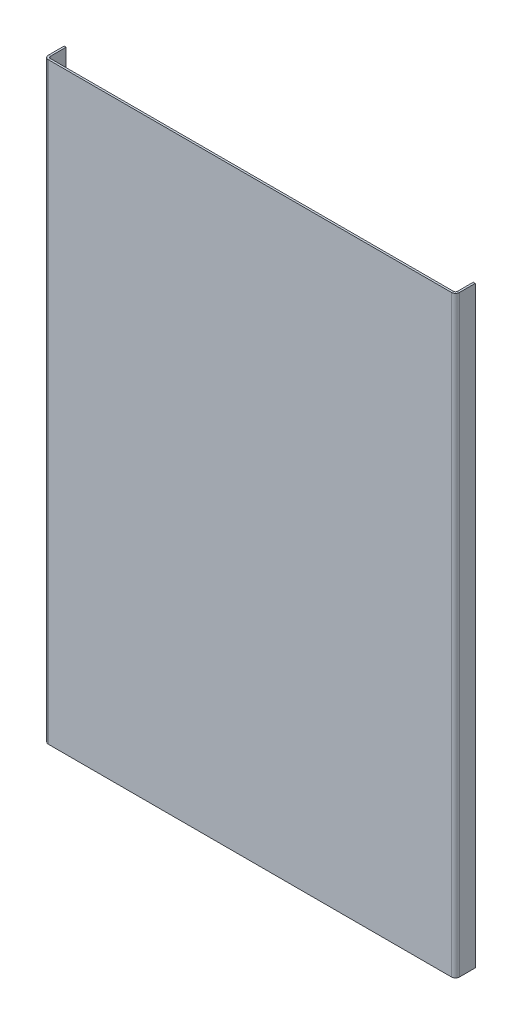
ISO-10303-21;
HEADER;
FILE_DESCRIPTION(('STEP AP214'),'2;1');
FILE_NAME('part.step','',(''),(''),'','','');
FILE_SCHEMA(('AUTOMOTIVE_DESIGN { 1 0 10303 214 1 1 1 1 }'));
ENDSEC;
DATA;
#1=APPLICATION_CONTEXT('core data for automotive mechanical design processes');
#2=APPLICATION_PROTOCOL_DEFINITION('international standard','automotive_design',2000,#1);
#3=PRODUCT_CONTEXT('',#1,'mechanical');
#4=PRODUCT('Part','Part','',(#3));
#5=PRODUCT_RELATED_PRODUCT_CATEGORY('part','',(#4));
#6=PRODUCT_DEFINITION_FORMATION('','',#4);
#7=PRODUCT_DEFINITION_CONTEXT('part definition',#1,'design');
#8=PRODUCT_DEFINITION('design','',#6,#7);
#9=PRODUCT_DEFINITION_SHAPE('','',#8);
#10=(LENGTH_UNIT() NAMED_UNIT(*) SI_UNIT(.MILLI.,.METRE.));
#11=(NAMED_UNIT(*) PLANE_ANGLE_UNIT() SI_UNIT($,.RADIAN.));
#12=(NAMED_UNIT(*) SI_UNIT($,.STERADIAN.) SOLID_ANGLE_UNIT());
#13=UNCERTAINTY_MEASURE_WITH_UNIT(LENGTH_MEASURE(1.E-05),#10,'distance_accuracy_value','');
#14=(GEOMETRIC_REPRESENTATION_CONTEXT(3) GLOBAL_UNCERTAINTY_ASSIGNED_CONTEXT((#13)) GLOBAL_UNIT_ASSIGNED_CONTEXT((#10,
#11,#12)) REPRESENTATION_CONTEXT('',''));
#15=CARTESIAN_POINT('',(0.,0.,0.));
#16=DIRECTION('',(0.,0.,1.));
#17=DIRECTION('',(1.,0.,0.));
#18=AXIS2_PLACEMENT_3D('',#15,#16,#17);
#19=CARTESIAN_POINT('',(-102.,-150.,-1.));
#20=DIRECTION('',(0.,-1.,0.));
#21=DIRECTION('',(0.,0.,-1.));
#22=AXIS2_PLACEMENT_3D('',#19,#20,#21);
#23=PLANE('',#22);
#24=DIRECTION('',(1.,0.,0.));
#25=VECTOR('',#24,1.);
#26=CARTESIAN_POINT('',(-102.,-150.,0.));
#27=LINE('',#26,#25);
#28=CARTESIAN_POINT('',(-102.,-150.,0.));
#29=VERTEX_POINT('',#28);
#30=CARTESIAN_POINT('',(102.,-150.,0.));
#31=VERTEX_POINT('',#30);
#32=EDGE_CURVE('E272',#29,#31,#27,.T.);
#33=ORIENTED_EDGE('',*,*,#32,.F.);
#34=DIRECTION('',(0.,0.,1.));
#35=VECTOR('',#34,1.);
#36=CARTESIAN_POINT('',(-102.,-150.,-1.));
#37=LINE('',#36,#35);
#38=CARTESIAN_POINT('',(-102.,-150.,-1.));
#39=VERTEX_POINT('',#38);
#40=EDGE_CURVE('E88',#39,#29,#37,.T.);
#41=ORIENTED_EDGE('',*,*,#40,.F.);
#42=DIRECTION('',(1.,0.,0.));
#43=VECTOR('',#42,1.);
#44=CARTESIAN_POINT('',(-102.,-150.,-1.));
#45=LINE('',#44,#43);
#46=CARTESIAN_POINT('',(102.,-150.,-1.));
#47=VERTEX_POINT('',#46);
#48=EDGE_CURVE('E277',#39,#47,#45,.T.);
#49=ORIENTED_EDGE('',*,*,#48,.T.);
#50=DIRECTION('',(0.,0.,1.));
#51=VECTOR('',#50,1.);
#52=CARTESIAN_POINT('',(102.,-150.,-1.));
#53=LINE('',#52,#51);
#54=EDGE_CURVE('E13',#47,#31,#53,.T.);
#55=ORIENTED_EDGE('',*,*,#54,.T.);
#56=EDGE_LOOP('',(#33,#41,#49,#55));
#57=FACE_BOUND('',#56,.T.);
#58=ADVANCED_FACE('F79',(#57),#23,.T.);
#59=CARTESIAN_POINT('',(-102.,150.,-1.));
#60=DIRECTION('',(0.,1.,0.));
#61=DIRECTION('',(0.,0.,1.));
#62=AXIS2_PLACEMENT_3D('',#59,#60,#61);
#63=PLANE('',#62);
#64=DIRECTION('',(-1.,0.,0.));
#65=VECTOR('',#64,1.);
#66=CARTESIAN_POINT('',(-102.,150.,0.));
#67=LINE('',#66,#65);
#68=CARTESIAN_POINT('',(102.,150.,0.));
#69=VERTEX_POINT('',#68);
#70=CARTESIAN_POINT('',(-102.,150.,0.));
#71=VERTEX_POINT('',#70);
#72=EDGE_CURVE('E282',#69,#71,#67,.T.);
#73=ORIENTED_EDGE('',*,*,#72,.F.);
#74=DIRECTION('',(0.,0.,1.));
#75=VECTOR('',#74,1.);
#76=CARTESIAN_POINT('',(102.,150.,-1.));
#77=LINE('',#76,#75);
#78=CARTESIAN_POINT('',(102.,150.,-1.));
#79=VERTEX_POINT('',#78);
#80=EDGE_CURVE('E83',#79,#69,#77,.T.);
#81=ORIENTED_EDGE('',*,*,#80,.F.);
#82=DIRECTION('',(-1.,0.,0.));
#83=VECTOR('',#82,1.);
#84=CARTESIAN_POINT('',(-102.,150.,-1.));
#85=LINE('',#84,#83);
#86=CARTESIAN_POINT('',(-102.,150.,-1.));
#87=VERTEX_POINT('',#86);
#88=EDGE_CURVE('E271',#79,#87,#85,.T.);
#89=ORIENTED_EDGE('',*,*,#88,.T.);
#90=DIRECTION('',(0.,0.,1.));
#91=VECTOR('',#90,1.);
#92=CARTESIAN_POINT('',(-102.,150.,-1.));
#93=LINE('',#92,#91);
#94=EDGE_CURVE('E288',#87,#71,#93,.T.);
#95=ORIENTED_EDGE('',*,*,#94,.T.);
#96=EDGE_LOOP('',(#73,#81,#89,#95));
#97=FACE_BOUND('',#96,.T.);
#98=ADVANCED_FACE('F81',(#97),#63,.T.);
#99=CARTESIAN_POINT('',(0.,0.,-1.));
#100=DIRECTION('',(0.,0.,-1.));
#101=DIRECTION('',(-1.,0.,0.));
#102=AXIS2_PLACEMENT_3D('',#99,#100,#101);
#103=PLANE('',#102);
#104=DIRECTION('',(0.,1.,0.));
#105=VECTOR('',#104,1.);
#106=CARTESIAN_POINT('',(102.,-150.,-1.));
#107=LINE('',#106,#105);
#108=EDGE_CURVE('E269',#47,#79,#107,.T.);
#109=ORIENTED_EDGE('',*,*,#108,.F.);
#110=ORIENTED_EDGE('',*,*,#48,.F.);
#111=DIRECTION('',(0.,-1.,0.));
#112=VECTOR('',#111,1.);
#113=CARTESIAN_POINT('',(-102.,-150.,-1.));
#114=LINE('',#113,#112);
#115=EDGE_CURVE('E275',#87,#39,#114,.T.);
#116=ORIENTED_EDGE('',*,*,#115,.F.);
#117=ORIENTED_EDGE('',*,*,#88,.F.);
#118=EDGE_LOOP('',(#109,#110,#116,#117));
#119=FACE_BOUND('',#118,.T.);
#120=ADVANCED_FACE('F310',(#119),#103,.T.);
#121=CARTESIAN_POINT('',(0.,0.,0.));
#122=DIRECTION('',(0.,0.,-1.));
#123=DIRECTION('',(-1.,0.,0.));
#124=AXIS2_PLACEMENT_3D('',#121,#122,#123);
#125=PLANE('',#124);
#126=DIRECTION('',(0.,1.,0.));
#127=VECTOR('',#126,1.);
#128=CARTESIAN_POINT('',(102.,-150.,0.));
#129=LINE('',#128,#127);
#130=EDGE_CURVE('E260',#31,#69,#129,.T.);
#131=ORIENTED_EDGE('',*,*,#130,.T.);
#132=ORIENTED_EDGE('',*,*,#72,.T.);
#133=DIRECTION('',(0.,-1.,0.));
#134=VECTOR('',#133,1.);
#135=CARTESIAN_POINT('',(-102.,-150.,0.));
#136=LINE('',#135,#134);
#137=EDGE_CURVE('E174',#71,#29,#136,.T.);
#138=ORIENTED_EDGE('',*,*,#137,.T.);
#139=ORIENTED_EDGE('',*,*,#32,.T.);
#140=EDGE_LOOP('',(#131,#132,#138,#139));
#141=FACE_BOUND('',#140,.T.);
#142=ADVANCED_FACE('F297',(#141),#125,.F.);
#143=CARTESIAN_POINT('',(102.,150.,-2.));
#144=DIRECTION('',(0.,1.,0.));
#145=DIRECTION('',(0.,0.,1.));
#146=AXIS2_PLACEMENT_3D('',#143,#144,#145);
#147=PLANE('',#146);
#148=DIRECTION('',(1.,0.,0.));
#149=VECTOR('',#148,1.);
#150=CARTESIAN_POINT('',(104.,150.,-2.));
#151=LINE('',#150,#149);
#152=CARTESIAN_POINT('',(103.,150.,-2.));
#153=VERTEX_POINT('',#152);
#154=CARTESIAN_POINT('',(104.,150.,-2.));
#155=VERTEX_POINT('',#154);
#156=EDGE_CURVE('E222',#153,#155,#151,.T.);
#157=ORIENTED_EDGE('',*,*,#156,.F.);
#158=CARTESIAN_POINT('',(102.,150.,-2.));
#159=DIRECTION('',(0.,-1.,0.));
#160=DIRECTION('',(0.,0.,-1.));
#161=AXIS2_PLACEMENT_3D('',#158,#159,#160);
#162=CIRCLE('',#161,1.);
#163=EDGE_CURVE('E264',#79,#153,#162,.F.);
#164=ORIENTED_EDGE('',*,*,#163,.F.);
#165=ORIENTED_EDGE('',*,*,#80,.T.);
#166=CARTESIAN_POINT('',(102.,150.,-2.));
#167=DIRECTION('',(0.,-1.,0.));
#168=DIRECTION('',(0.,0.,-1.));
#169=AXIS2_PLACEMENT_3D('',#166,#167,#168);
#170=CIRCLE('',#169,2.);
#171=EDGE_CURVE('E104',#69,#155,#170,.F.);
#172=ORIENTED_EDGE('',*,*,#171,.T.);
#173=EDGE_LOOP('',(#157,#164,#165,#172));
#174=FACE_BOUND('',#173,.T.);
#175=ADVANCED_FACE('F294',(#174),#147,.T.);
#176=CARTESIAN_POINT('',(102.,-150.,-2.));
#177=DIRECTION('',(0.,1.,0.));
#178=DIRECTION('',(0.,0.,1.));
#179=AXIS2_PLACEMENT_3D('',#176,#177,#178);
#180=PLANE('',#179);
#181=CARTESIAN_POINT('',(102.,-150.,-2.));
#182=DIRECTION('',(0.,-1.,0.));
#183=DIRECTION('',(0.,0.,-1.));
#184=AXIS2_PLACEMENT_3D('',#181,#182,#183);
#185=CIRCLE('',#184,1.);
#186=CARTESIAN_POINT('',(103.,-150.,-2.));
#187=VERTEX_POINT('',#186);
#188=EDGE_CURVE('E229',#187,#47,#185,.T.);
#189=ORIENTED_EDGE('',*,*,#188,.F.);
#190=DIRECTION('',(1.,0.,0.));
#191=VECTOR('',#190,1.);
#192=CARTESIAN_POINT('',(103.,-150.,-2.));
#193=LINE('',#192,#191);
#194=CARTESIAN_POINT('',(104.,-150.,-2.));
#195=VERTEX_POINT('',#194);
#196=EDGE_CURVE('E252',#187,#195,#193,.T.);
#197=ORIENTED_EDGE('',*,*,#196,.T.);
#198=CARTESIAN_POINT('',(102.,-150.,-2.));
#199=DIRECTION('',(0.,-1.,0.));
#200=DIRECTION('',(0.,0.,-1.));
#201=AXIS2_PLACEMENT_3D('',#198,#199,#200);
#202=CIRCLE('',#201,2.);
#203=EDGE_CURVE('E261',#195,#31,#202,.T.);
#204=ORIENTED_EDGE('',*,*,#203,.T.);
#205=ORIENTED_EDGE('',*,*,#54,.F.);
#206=EDGE_LOOP('',(#189,#197,#204,#205));
#207=FACE_BOUND('',#206,.T.);
#208=ADVANCED_FACE('F302',(#207),#180,.F.);
#209=CARTESIAN_POINT('',(102.,-150.,-2.));
#210=DIRECTION('',(0.,-1.,0.));
#211=DIRECTION('',(1.,0.,0.));
#212=AXIS2_PLACEMENT_3D('',#209,#210,#211);
#213=CYLINDRICAL_SURFACE('',#212,2.);
#214=ORIENTED_EDGE('',*,*,#130,.F.);
#215=ORIENTED_EDGE('',*,*,#203,.F.);
#216=DIRECTION('',(0.,-1.,0.));
#217=VECTOR('',#216,1.);
#218=CARTESIAN_POINT('',(104.,0.,-2.));
#219=LINE('',#218,#217);
#220=EDGE_CURVE('E249',#155,#195,#219,.T.);
#221=ORIENTED_EDGE('',*,*,#220,.F.);
#222=ORIENTED_EDGE('',*,*,#171,.F.);
#223=EDGE_LOOP('',(#214,#215,#221,#222));
#224=FACE_BOUND('',#223,.T.);
#225=ADVANCED_FACE('F299',(#224),#213,.T.);
#226=CARTESIAN_POINT('',(102.,-150.,-2.));
#227=DIRECTION('',(0.,-1.,0.));
#228=DIRECTION('',(1.,0.,0.));
#229=AXIS2_PLACEMENT_3D('',#226,#227,#228);
#230=CYLINDRICAL_SURFACE('',#229,1.);
#231=ORIENTED_EDGE('',*,*,#108,.T.);
#232=ORIENTED_EDGE('',*,*,#163,.T.);
#233=DIRECTION('',(0.,1.,0.));
#234=VECTOR('',#233,1.);
#235=CARTESIAN_POINT('',(103.,150.,-2.));
#236=LINE('',#235,#234);
#237=EDGE_CURVE('E255',#153,#187,#236,.F.);
#238=ORIENTED_EDGE('',*,*,#237,.T.);
#239=ORIENTED_EDGE('',*,*,#188,.T.);
#240=EDGE_LOOP('',(#231,#232,#238,#239));
#241=FACE_BOUND('',#240,.T.);
#242=ADVANCED_FACE('F312',(#241),#230,.F.);
#243=CARTESIAN_POINT('',(104.,-150.,-0.999999999999997));
#244=DIRECTION('',(0.,-1.,0.));
#245=DIRECTION('',(0.,0.,-1.));
#246=AXIS2_PLACEMENT_3D('',#243,#244,#245);
#247=PLANE('',#246);
#248=DIRECTION('',(0.,0.,1.));
#249=VECTOR('',#248,1.);
#250=CARTESIAN_POINT('',(104.,-150.,-0.999999999999997));
#251=LINE('',#250,#249);
#252=CARTESIAN_POINT('',(104.,-150.,-10.));
#253=VERTEX_POINT('',#252);
#254=EDGE_CURVE('E233',#253,#195,#251,.T.);
#255=ORIENTED_EDGE('',*,*,#254,.T.);
#256=ORIENTED_EDGE('',*,*,#196,.F.);
#257=DIRECTION('',(0.,0.,-1.));
#258=VECTOR('',#257,1.);
#259=CARTESIAN_POINT('',(103.,-150.,7.77156117237609E-13));
#260=LINE('',#259,#258);
#261=CARTESIAN_POINT('',(103.,-150.,-10.));
#262=VERTEX_POINT('',#261);
#263=EDGE_CURVE('E241',#262,#187,#260,.F.);
#264=ORIENTED_EDGE('',*,*,#263,.F.);
#265=DIRECTION('',(-1.,0.,0.));
#266=VECTOR('',#265,1.);
#267=CARTESIAN_POINT('',(104.,-150.,-10.));
#268=LINE('',#267,#266);
#269=EDGE_CURVE('E227',#253,#262,#268,.T.);
#270=ORIENTED_EDGE('',*,*,#269,.F.);
#271=EDGE_LOOP('',(#255,#256,#264,#270));
#272=FACE_BOUND('',#271,.T.);
#273=ADVANCED_FACE('F320',(#272),#247,.T.);
#274=CARTESIAN_POINT('',(104.,150.,-10.));
#275=DIRECTION('',(0.,1.,0.));
#276=DIRECTION('',(0.,0.,1.));
#277=AXIS2_PLACEMENT_3D('',#274,#275,#276);
#278=PLANE('',#277);
#279=DIRECTION('',(0.,0.,1.));
#280=VECTOR('',#279,1.);
#281=CARTESIAN_POINT('',(103.,150.,-1.48029736616687E-13));
#282=LINE('',#281,#280);
#283=CARTESIAN_POINT('',(103.,150.,-10.));
#284=VERTEX_POINT('',#283);
#285=EDGE_CURVE('E247',#153,#284,#282,.F.);
#286=ORIENTED_EDGE('',*,*,#285,.F.);
#287=ORIENTED_EDGE('',*,*,#156,.T.);
#288=DIRECTION('',(0.,0.,-1.));
#289=VECTOR('',#288,1.);
#290=CARTESIAN_POINT('',(104.,150.,-10.));
#291=LINE('',#290,#289);
#292=CARTESIAN_POINT('',(104.,150.,-10.));
#293=VERTEX_POINT('',#292);
#294=EDGE_CURVE('E239',#155,#293,#291,.T.);
#295=ORIENTED_EDGE('',*,*,#294,.T.);
#296=DIRECTION('',(-1.,0.,0.));
#297=VECTOR('',#296,1.);
#298=CARTESIAN_POINT('',(104.,150.,-10.));
#299=LINE('',#298,#297);
#300=EDGE_CURVE('E230',#293,#284,#299,.T.);
#301=ORIENTED_EDGE('',*,*,#300,.T.);
#302=EDGE_LOOP('',(#286,#287,#295,#301));
#303=FACE_BOUND('',#302,.T.);
#304=ADVANCED_FACE('F328',(#303),#278,.T.);
#305=CARTESIAN_POINT('',(104.,0.,3.18054671649304E-13));
#306=DIRECTION('',(1.,0.,0.));
#307=DIRECTION('',(0.,0.,-1.));
#308=AXIS2_PLACEMENT_3D('',#305,#306,#307);
#309=PLANE('',#308);
#310=ORIENTED_EDGE('',*,*,#294,.F.);
#311=ORIENTED_EDGE('',*,*,#220,.T.);
#312=ORIENTED_EDGE('',*,*,#254,.F.);
#313=DIRECTION('',(0.,-1.,0.));
#314=VECTOR('',#313,1.);
#315=CARTESIAN_POINT('',(104.,-150.,-10.));
#316=LINE('',#315,#314);
#317=EDGE_CURVE('E236',#293,#253,#316,.T.);
#318=ORIENTED_EDGE('',*,*,#317,.F.);
#319=EDGE_LOOP('',(#310,#311,#312,#318));
#320=FACE_BOUND('',#319,.T.);
#321=ADVANCED_FACE('F325',(#320),#309,.T.);
#322=CARTESIAN_POINT('',(103.,0.,3.14563190310461E-13));
#323=DIRECTION('',(1.,0.,0.));
#324=DIRECTION('',(0.,0.,-1.));
#325=AXIS2_PLACEMENT_3D('',#322,#323,#324);
#326=PLANE('',#325);
#327=ORIENTED_EDGE('',*,*,#237,.F.);
#328=ORIENTED_EDGE('',*,*,#285,.T.);
#329=DIRECTION('',(0.,1.,0.));
#330=VECTOR('',#329,1.);
#331=CARTESIAN_POINT('',(103.,0.,-10.));
#332=LINE('',#331,#330);
#333=EDGE_CURVE('E244',#284,#262,#332,.F.);
#334=ORIENTED_EDGE('',*,*,#333,.T.);
#335=ORIENTED_EDGE('',*,*,#263,.T.);
#336=EDGE_LOOP('',(#327,#328,#334,#335));
#337=FACE_BOUND('',#336,.T.);
#338=ADVANCED_FACE('F316',(#337),#326,.F.);
#339=CARTESIAN_POINT('',(104.,-150.,-10.));
#340=DIRECTION('',(0.,0.,-1.));
#341=DIRECTION('',(-1.,0.,0.));
#342=AXIS2_PLACEMENT_3D('',#339,#340,#341);
#343=PLANE('',#342);
#344=ORIENTED_EDGE('',*,*,#333,.F.);
#345=ORIENTED_EDGE('',*,*,#300,.F.);
#346=ORIENTED_EDGE('',*,*,#317,.T.);
#347=ORIENTED_EDGE('',*,*,#269,.T.);
#348=EDGE_LOOP('',(#344,#345,#346,#347));
#349=FACE_BOUND('',#348,.T.);
#350=ADVANCED_FACE('F330',(#349),#343,.T.);
#351=CARTESIAN_POINT('',(-102.,-150.,-2.));
#352=DIRECTION('',(0.,-1.,0.));
#353=DIRECTION('',(0.,0.,-1.));
#354=AXIS2_PLACEMENT_3D('',#351,#352,#353);
#355=PLANE('',#354);
#356=DIRECTION('',(1.,0.,0.));
#357=VECTOR('',#356,1.);
#358=CARTESIAN_POINT('',(-104.,-150.,-2.));
#359=LINE('',#358,#357);
#360=CARTESIAN_POINT('',(-103.,-150.,-2.));
#361=VERTEX_POINT('',#360);
#362=CARTESIAN_POINT('',(-104.,-150.,-2.));
#363=VERTEX_POINT('',#362);
#364=EDGE_CURVE('E219',#361,#363,#359,.F.);
#365=ORIENTED_EDGE('',*,*,#364,.F.);
#366=CARTESIAN_POINT('',(-102.,-150.,-2.));
#367=DIRECTION('',(0.,1.,0.));
#368=DIRECTION('',(0.,0.,1.));
#369=AXIS2_PLACEMENT_3D('',#366,#367,#368);
#370=CIRCLE('',#369,1.);
#371=EDGE_CURVE('E177',#39,#361,#370,.F.);
#372=ORIENTED_EDGE('',*,*,#371,.F.);
#373=ORIENTED_EDGE('',*,*,#40,.T.);
#374=CARTESIAN_POINT('',(-102.,-150.,-2.));
#375=DIRECTION('',(0.,1.,0.));
#376=DIRECTION('',(0.,0.,1.));
#377=AXIS2_PLACEMENT_3D('',#374,#375,#376);
#378=CIRCLE('',#377,2.);
#379=EDGE_CURVE('E96',#29,#363,#378,.F.);
#380=ORIENTED_EDGE('',*,*,#379,.T.);
#381=EDGE_LOOP('',(#365,#372,#373,#380));
#382=FACE_BOUND('',#381,.T.);
#383=ADVANCED_FACE('F332',(#382),#355,.T.);
#384=CARTESIAN_POINT('',(-102.,150.,-2.));
#385=DIRECTION('',(0.,-1.,0.));
#386=DIRECTION('',(0.,0.,-1.));
#387=AXIS2_PLACEMENT_3D('',#384,#385,#386);
#388=PLANE('',#387);
#389=CARTESIAN_POINT('',(-102.,150.,-2.));
#390=DIRECTION('',(0.,1.,0.));
#391=DIRECTION('',(0.,0.,1.));
#392=AXIS2_PLACEMENT_3D('',#389,#390,#391);
#393=CIRCLE('',#392,1.);
#394=CARTESIAN_POINT('',(-103.,150.,-2.));
#395=VERTEX_POINT('',#394);
#396=EDGE_CURVE('E184',#395,#87,#393,.T.);
#397=ORIENTED_EDGE('',*,*,#396,.F.);
#398=DIRECTION('',(1.,0.,0.));
#399=VECTOR('',#398,1.);
#400=CARTESIAN_POINT('',(-103.,150.,-2.));
#401=LINE('',#400,#399);
#402=CARTESIAN_POINT('',(-104.,150.,-2.));
#403=VERTEX_POINT('',#402);
#404=EDGE_CURVE('E181',#395,#403,#401,.F.);
#405=ORIENTED_EDGE('',*,*,#404,.T.);
#406=CARTESIAN_POINT('',(-102.,150.,-2.));
#407=DIRECTION('',(0.,1.,0.));
#408=DIRECTION('',(0.,0.,1.));
#409=AXIS2_PLACEMENT_3D('',#406,#407,#408);
#410=CIRCLE('',#409,2.);
#411=EDGE_CURVE('E168',#403,#71,#410,.T.);
#412=ORIENTED_EDGE('',*,*,#411,.T.);
#413=ORIENTED_EDGE('',*,*,#94,.F.);
#414=EDGE_LOOP('',(#397,#405,#412,#413));
#415=FACE_BOUND('',#414,.T.);
#416=ADVANCED_FACE('F182',(#415),#388,.F.);
#417=CARTESIAN_POINT('',(-102.,150.,-2.));
#418=DIRECTION('',(0.,1.,0.));
#419=DIRECTION('',(-1.,0.,0.));
#420=AXIS2_PLACEMENT_3D('',#417,#418,#419);
#421=CYLINDRICAL_SURFACE('',#420,2.);
#422=ORIENTED_EDGE('',*,*,#137,.F.);
#423=ORIENTED_EDGE('',*,*,#411,.F.);
#424=DIRECTION('',(0.,1.,0.));
#425=VECTOR('',#424,1.);
#426=CARTESIAN_POINT('',(-104.,0.,-2.));
#427=LINE('',#426,#425);
#428=EDGE_CURVE('E172',#363,#403,#427,.T.);
#429=ORIENTED_EDGE('',*,*,#428,.F.);
#430=ORIENTED_EDGE('',*,*,#379,.F.);
#431=EDGE_LOOP('',(#422,#423,#429,#430));
#432=FACE_BOUND('',#431,.T.);
#433=ADVANCED_FACE('F170',(#432),#421,.T.);
#434=CARTESIAN_POINT('',(-102.,150.,-2.));
#435=DIRECTION('',(0.,1.,0.));
#436=DIRECTION('',(-1.,0.,0.));
#437=AXIS2_PLACEMENT_3D('',#434,#435,#436);
#438=CYLINDRICAL_SURFACE('',#437,1.);
#439=ORIENTED_EDGE('',*,*,#115,.T.);
#440=ORIENTED_EDGE('',*,*,#371,.T.);
#441=DIRECTION('',(0.,-1.,0.));
#442=VECTOR('',#441,1.);
#443=CARTESIAN_POINT('',(-103.,-150.,-2.));
#444=LINE('',#443,#442);
#445=EDGE_CURVE('E188',#361,#395,#444,.F.);
#446=ORIENTED_EDGE('',*,*,#445,.T.);
#447=ORIENTED_EDGE('',*,*,#396,.T.);
#448=EDGE_LOOP('',(#439,#440,#446,#447));
#449=FACE_BOUND('',#448,.T.);
#450=ADVANCED_FACE('F370',(#449),#438,.F.);
#451=CARTESIAN_POINT('',(-104.,150.,-10.));
#452=DIRECTION('',(0.,-1.,0.));
#453=DIRECTION('',(0.,0.,-1.));
#454=AXIS2_PLACEMENT_3D('',#451,#452,#453);
#455=PLANE('',#454);
#456=ORIENTED_EDGE('',*,*,#404,.F.);
#457=DIRECTION('',(0.,0.,-1.));
#458=VECTOR('',#457,1.);
#459=CARTESIAN_POINT('',(-103.,150.,-10.));
#460=LINE('',#459,#458);
#461=CARTESIAN_POINT('',(-103.,150.,-10.));
#462=VERTEX_POINT('',#461);
#463=EDGE_CURVE('E212',#395,#462,#460,.T.);
#464=ORIENTED_EDGE('',*,*,#463,.T.);
#465=DIRECTION('',(1.,0.,0.));
#466=VECTOR('',#465,1.);
#467=CARTESIAN_POINT('',(-104.,150.,-10.));
#468=LINE('',#467,#466);
#469=CARTESIAN_POINT('',(-104.,150.,-10.));
#470=VERTEX_POINT('',#469);
#471=EDGE_CURVE('E201',#470,#462,#468,.T.);
#472=ORIENTED_EDGE('',*,*,#471,.F.);
#473=DIRECTION('',(0.,0.,1.));
#474=VECTOR('',#473,1.);
#475=CARTESIAN_POINT('',(-104.,150.,-1.44538255277844E-13));
#476=LINE('',#475,#474);
#477=EDGE_CURVE('E193',#403,#470,#476,.F.);
#478=ORIENTED_EDGE('',*,*,#477,.F.);
#479=EDGE_LOOP('',(#456,#464,#472,#478));
#480=FACE_BOUND('',#479,.T.);
#481=ADVANCED_FACE('F199',(#480),#455,.F.);
#482=CARTESIAN_POINT('',(-104.,-150.,-0.999999999999997));
#483=DIRECTION('',(0.,1.,0.));
#484=DIRECTION('',(0.,0.,1.));
#485=AXIS2_PLACEMENT_3D('',#482,#483,#484);
#486=PLANE('',#485);
#487=ORIENTED_EDGE('',*,*,#364,.T.);
#488=DIRECTION('',(0.,0.,-1.));
#489=VECTOR('',#488,1.);
#490=CARTESIAN_POINT('',(-104.,-150.,7.80647598576452E-13));
#491=LINE('',#490,#489);
#492=CARTESIAN_POINT('',(-104.,-150.,-10.));
#493=VERTEX_POINT('',#492);
#494=EDGE_CURVE('E196',#493,#363,#491,.F.);
#495=ORIENTED_EDGE('',*,*,#494,.F.);
#496=DIRECTION('',(1.,0.,0.));
#497=VECTOR('',#496,1.);
#498=CARTESIAN_POINT('',(-104.,-150.,-10.));
#499=LINE('',#498,#497);
#500=CARTESIAN_POINT('',(-103.,-150.,-10.));
#501=VERTEX_POINT('',#500);
#502=EDGE_CURVE('E203',#493,#501,#499,.T.);
#503=ORIENTED_EDGE('',*,*,#502,.T.);
#504=DIRECTION('',(0.,0.,1.));
#505=VECTOR('',#504,1.);
#506=CARTESIAN_POINT('',(-103.,-150.,-1.));
#507=LINE('',#506,#505);
#508=EDGE_CURVE('E197',#501,#361,#507,.T.);
#509=ORIENTED_EDGE('',*,*,#508,.T.);
#510=EDGE_LOOP('',(#487,#495,#503,#509));
#511=FACE_BOUND('',#510,.T.);
#512=ADVANCED_FACE('F376',(#511),#486,.F.);
#513=CARTESIAN_POINT('',(-104.,0.,3.18054671649304E-13));
#514=DIRECTION('',(-1.,0.,0.));
#515=DIRECTION('',(0.,0.,-1.));
#516=AXIS2_PLACEMENT_3D('',#513,#514,#515);
#517=PLANE('',#516);
#518=ORIENTED_EDGE('',*,*,#494,.T.);
#519=ORIENTED_EDGE('',*,*,#428,.T.);
#520=ORIENTED_EDGE('',*,*,#477,.T.);
#521=DIRECTION('',(0.,1.,0.));
#522=VECTOR('',#521,1.);
#523=CARTESIAN_POINT('',(-104.,0.,-10.));
#524=LINE('',#523,#522);
#525=EDGE_CURVE('E204',#470,#493,#524,.F.);
#526=ORIENTED_EDGE('',*,*,#525,.T.);
#527=EDGE_LOOP('',(#518,#519,#520,#526));
#528=FACE_BOUND('',#527,.T.);
#529=ADVANCED_FACE('F192',(#528),#517,.T.);
#530=CARTESIAN_POINT('',(-103.,0.,3.14563190310461E-13));
#531=DIRECTION('',(-1.,0.,0.));
#532=DIRECTION('',(0.,0.,-1.));
#533=AXIS2_PLACEMENT_3D('',#530,#531,#532);
#534=PLANE('',#533);
#535=ORIENTED_EDGE('',*,*,#445,.F.);
#536=ORIENTED_EDGE('',*,*,#508,.F.);
#537=DIRECTION('',(0.,-1.,0.));
#538=VECTOR('',#537,1.);
#539=CARTESIAN_POINT('',(-103.,-150.,-10.));
#540=LINE('',#539,#538);
#541=EDGE_CURVE('E214',#462,#501,#540,.T.);
#542=ORIENTED_EDGE('',*,*,#541,.F.);
#543=ORIENTED_EDGE('',*,*,#463,.F.);
#544=EDGE_LOOP('',(#535,#536,#542,#543));
#545=FACE_BOUND('',#544,.T.);
#546=ADVANCED_FACE('F383',(#545),#534,.F.);
#547=CARTESIAN_POINT('',(-104.,-150.,-10.));
#548=DIRECTION('',(0.,0.,1.));
#549=DIRECTION('',(1.,0.,0.));
#550=AXIS2_PLACEMENT_3D('',#547,#548,#549);
#551=PLANE('',#550);
#552=ORIENTED_EDGE('',*,*,#541,.T.);
#553=ORIENTED_EDGE('',*,*,#502,.F.);
#554=ORIENTED_EDGE('',*,*,#525,.F.);
#555=ORIENTED_EDGE('',*,*,#471,.T.);
#556=EDGE_LOOP('',(#552,#553,#554,#555));
#557=FACE_BOUND('',#556,.T.);
#558=ADVANCED_FACE('F380',(#557),#551,.F.);
#559=CLOSED_SHELL('',(#58,#98,#120,#142,#175,#208,#225,#242,#273,#304,#321,#338,#350,#383,#416,
#433,#450,#481,#512,#529,#546,#558));
#560=MANIFOLD_SOLID_BREP('B2',#559);
#561=ADVANCED_BREP_SHAPE_REPRESENTATION('',(#18,#560),#14);
#562=SHAPE_DEFINITION_REPRESENTATION(#9,#561);
ENDSEC;
END-ISO-10303-21;
